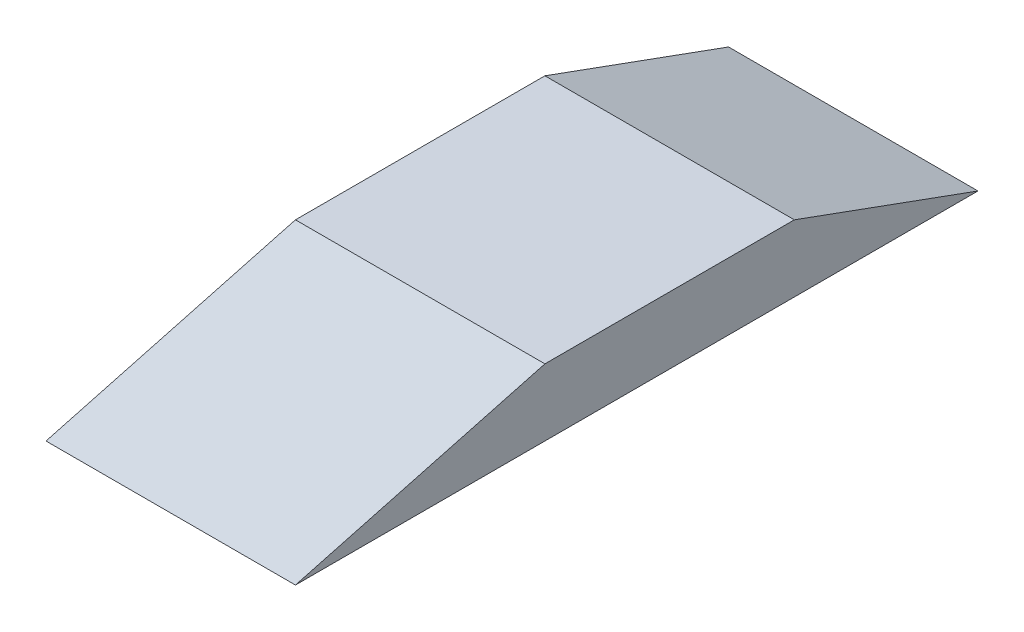
ISO-10303-21;
HEADER;
FILE_DESCRIPTION(('STEP AP214'),'2;1');
FILE_NAME('part.step','',(''),(''),'','','');
FILE_SCHEMA(('AUTOMOTIVE_DESIGN { 1 0 10303 214 1 1 1 1 }'));
ENDSEC;
DATA;
#1=APPLICATION_CONTEXT('core data for automotive mechanical design processes');
#2=APPLICATION_PROTOCOL_DEFINITION('international standard','automotive_design',2000,#1);
#3=PRODUCT_CONTEXT('',#1,'mechanical');
#4=PRODUCT('Part','Part','',(#3));
#5=PRODUCT_RELATED_PRODUCT_CATEGORY('part','',(#4));
#6=PRODUCT_DEFINITION_FORMATION('','',#4);
#7=PRODUCT_DEFINITION_CONTEXT('part definition',#1,'design');
#8=PRODUCT_DEFINITION('design','',#6,#7);
#9=PRODUCT_DEFINITION_SHAPE('','',#8);
#10=(LENGTH_UNIT() NAMED_UNIT(*) SI_UNIT(.MILLI.,.METRE.));
#11=(NAMED_UNIT(*) PLANE_ANGLE_UNIT() SI_UNIT($,.RADIAN.));
#12=(NAMED_UNIT(*) SI_UNIT($,.STERADIAN.) SOLID_ANGLE_UNIT());
#13=UNCERTAINTY_MEASURE_WITH_UNIT(LENGTH_MEASURE(1.E-05),#10,'distance_accuracy_value','');
#14=(GEOMETRIC_REPRESENTATION_CONTEXT(3) GLOBAL_UNCERTAINTY_ASSIGNED_CONTEXT((#13)) GLOBAL_UNIT_ASSIGNED_CONTEXT((#10,
#11,#12)) REPRESENTATION_CONTEXT('',''));
#15=CARTESIAN_POINT('',(0.,0.,0.));
#16=DIRECTION('',(0.,0.,1.));
#17=DIRECTION('',(1.,0.,0.));
#18=AXIS2_PLACEMENT_3D('',#15,#16,#17);
#19=CARTESIAN_POINT('',(1500.,-4.34084634463935E-13,0.));
#20=DIRECTION('',(0.,-1.,0.));
#21=DIRECTION('',(0.,0.,-1.));
#22=AXIS2_PLACEMENT_3D('',#19,#20,#21);
#23=PLANE('',#22);
#24=DIRECTION('',(0.,0.,1.));
#25=VECTOR('',#24,1.);
#26=CARTESIAN_POINT('',(0.,-4.34084634463935E-13,0.));
#27=LINE('',#26,#25);
#28=CARTESIAN_POINT('',(0.,4.44089209850063E-13,-4104.27653364841));
#29=VERTEX_POINT('',#28);
#30=CARTESIAN_POINT('',(0.,0.,0.));
#31=VERTEX_POINT('',#30);
#32=EDGE_CURVE('E109',#29,#31,#27,.T.);
#33=ORIENTED_EDGE('',*,*,#32,.F.);
#34=DIRECTION('',(-1.,0.,0.));
#35=VECTOR('',#34,1.);
#36=CARTESIAN_POINT('',(1500.,4.44089209850063E-13,-4104.27653364841));
#37=LINE('',#36,#35);
#38=CARTESIAN_POINT('',(1500.,4.44089209850063E-13,-4104.27653364841));
#39=VERTEX_POINT('',#38);
#40=EDGE_CURVE('E11',#39,#29,#37,.T.);
#41=ORIENTED_EDGE('',*,*,#40,.F.);
#42=DIRECTION('',(0.,0.,1.));
#43=VECTOR('',#42,1.);
#44=CARTESIAN_POINT('',(1500.,-4.34084634463935E-13,0.));
#45=LINE('',#44,#43);
#46=CARTESIAN_POINT('',(1500.,0.,0.));
#47=VERTEX_POINT('',#46);
#48=EDGE_CURVE('E99',#39,#47,#45,.T.);
#49=ORIENTED_EDGE('',*,*,#48,.T.);
#50=DIRECTION('',(-1.,0.,0.));
#51=VECTOR('',#50,1.);
#52=CARTESIAN_POINT('',(1500.,0.,0.));
#53=LINE('',#52,#51);
#54=EDGE_CURVE('E80',#47,#31,#53,.T.);
#55=ORIENTED_EDGE('',*,*,#54,.T.);
#56=EDGE_LOOP('',(#33,#41,#49,#55));
#57=FACE_BOUND('',#56,.T.);
#58=ADVANCED_FACE('F41',(#57),#23,.T.);
#59=CARTESIAN_POINT('',(1500.,1319.08905127819,-480.109151011695));
#60=DIRECTION('',(0.,0.939692620785911,-0.342020143325662));
#61=DIRECTION('',(0.,0.342020143325662,0.939692620785911));
#62=AXIS2_PLACEMENT_3D('',#59,#60,#61);
#63=PLANE('',#62);
#64=DIRECTION('',(0.,-0.342020143325662,-0.939692620785911));
#65=VECTOR('',#64,1.);
#66=CARTESIAN_POINT('',(0.,1319.08905127819,-480.109151011695));
#67=LINE('',#66,#65);
#68=CARTESIAN_POINT('',(0.,401.923788646674,-3000.));
#69=VERTEX_POINT('',#68);
#70=EDGE_CURVE('E91',#69,#29,#67,.T.);
#71=ORIENTED_EDGE('',*,*,#70,.F.);
#72=DIRECTION('',(-1.,0.,0.));
#73=VECTOR('',#72,1.);
#74=CARTESIAN_POINT('',(1500.,401.923788646674,-3000.));
#75=LINE('',#74,#73);
#76=CARTESIAN_POINT('',(1500.,401.923788646674,-3000.));
#77=VERTEX_POINT('',#76);
#78=EDGE_CURVE('E50',#77,#69,#75,.T.);
#79=ORIENTED_EDGE('',*,*,#78,.F.);
#80=DIRECTION('',(0.,-0.342020143325662,-0.939692620785911));
#81=VECTOR('',#80,1.);
#82=CARTESIAN_POINT('',(1500.,1319.08905127819,-480.109151011695));
#83=LINE('',#82,#81);
#84=EDGE_CURVE('E89',#77,#39,#83,.T.);
#85=ORIENTED_EDGE('',*,*,#84,.T.);
#86=ORIENTED_EDGE('',*,*,#40,.T.);
#87=EDGE_LOOP('',(#71,#79,#85,#86));
#88=FACE_BOUND('',#87,.T.);
#89=ADVANCED_FACE('F88',(#88),#63,.T.);
#90=CARTESIAN_POINT('',(1500.,401.923788646674,0.));
#91=DIRECTION('',(0.,1.,0.));
#92=DIRECTION('',(0.,0.,1.));
#93=AXIS2_PLACEMENT_3D('',#90,#91,#92);
#94=PLANE('',#93);
#95=DIRECTION('',(0.,0.,-1.));
#96=VECTOR('',#95,1.);
#97=CARTESIAN_POINT('',(0.,401.923788646674,0.));
#98=LINE('',#97,#96);
#99=CARTESIAN_POINT('',(0.,401.923788646674,-1500.));
#100=VERTEX_POINT('',#99);
#101=EDGE_CURVE('E115',#100,#69,#98,.T.);
#102=ORIENTED_EDGE('',*,*,#101,.F.);
#103=DIRECTION('',(-1.,0.,0.));
#104=VECTOR('',#103,1.);
#105=CARTESIAN_POINT('',(1500.,401.923788646674,-1500.));
#106=LINE('',#105,#104);
#107=CARTESIAN_POINT('',(1500.,401.923788646674,-1500.));
#108=VERTEX_POINT('',#107);
#109=EDGE_CURVE('E73',#108,#100,#106,.T.);
#110=ORIENTED_EDGE('',*,*,#109,.F.);
#111=DIRECTION('',(0.,0.,-1.));
#112=VECTOR('',#111,1.);
#113=CARTESIAN_POINT('',(1500.,401.923788646674,0.));
#114=LINE('',#113,#112);
#115=EDGE_CURVE('E98',#108,#77,#114,.T.);
#116=ORIENTED_EDGE('',*,*,#115,.T.);
#117=ORIENTED_EDGE('',*,*,#78,.T.);
#118=EDGE_LOOP('',(#102,#110,#116,#117));
#119=FACE_BOUND('',#118,.T.);
#120=ADVANCED_FACE('F102',(#119),#94,.T.);
#121=CARTESIAN_POINT('',(1500.,0.,0.));
#122=DIRECTION('',(0.,-0.96592582628907,-0.258819045102515));
#123=DIRECTION('',(0.,0.258819045102515,-0.96592582628907));
#124=AXIS2_PLACEMENT_3D('',#121,#122,#123);
#125=PLANE('',#124);
#126=DIRECTION('',(0.,-0.258819045102515,0.96592582628907));
#127=VECTOR('',#126,1.);
#128=CARTESIAN_POINT('',(0.,0.,0.));
#129=LINE('',#128,#127);
#130=EDGE_CURVE('E118',#100,#31,#129,.T.);
#131=ORIENTED_EDGE('',*,*,#130,.T.);
#132=ORIENTED_EDGE('',*,*,#54,.F.);
#133=DIRECTION('',(0.,-0.258819045102515,0.96592582628907));
#134=VECTOR('',#133,1.);
#135=CARTESIAN_POINT('',(1500.,0.,0.));
#136=LINE('',#135,#134);
#137=EDGE_CURVE('E58',#108,#47,#136,.T.);
#138=ORIENTED_EDGE('',*,*,#137,.F.);
#139=ORIENTED_EDGE('',*,*,#109,.T.);
#140=EDGE_LOOP('',(#131,#132,#138,#139));
#141=FACE_BOUND('',#140,.T.);
#142=ADVANCED_FACE('F132',(#141),#125,.F.);
#143=CARTESIAN_POINT('',(1500.,0.,0.));
#144=DIRECTION('',(1.,0.,0.));
#145=DIRECTION('',(0.,0.,-1.));
#146=AXIS2_PLACEMENT_3D('',#143,#144,#145);
#147=PLANE('',#146);
#148=ORIENTED_EDGE('',*,*,#48,.F.);
#149=ORIENTED_EDGE('',*,*,#84,.F.);
#150=ORIENTED_EDGE('',*,*,#115,.F.);
#151=ORIENTED_EDGE('',*,*,#137,.T.);
#152=EDGE_LOOP('',(#148,#149,#150,#151));
#153=FACE_BOUND('',#152,.T.);
#154=ADVANCED_FACE('F97',(#153),#147,.T.);
#155=CARTESIAN_POINT('',(0.,0.,0.));
#156=DIRECTION('',(1.,0.,0.));
#157=DIRECTION('',(0.,0.,-1.));
#158=AXIS2_PLACEMENT_3D('',#155,#156,#157);
#159=PLANE('',#158);
#160=ORIENTED_EDGE('',*,*,#32,.T.);
#161=ORIENTED_EDGE('',*,*,#130,.F.);
#162=ORIENTED_EDGE('',*,*,#101,.T.);
#163=ORIENTED_EDGE('',*,*,#70,.T.);
#164=EDGE_LOOP('',(#160,#161,#162,#163));
#165=FACE_BOUND('',#164,.T.);
#166=ADVANCED_FACE('F137',(#165),#159,.F.);
#167=CLOSED_SHELL('',(#58,#89,#120,#142,#154,#166));
#168=MANIFOLD_SOLID_BREP('B2',#167);
#169=ADVANCED_BREP_SHAPE_REPRESENTATION('',(#18,#168),#14);
#170=SHAPE_DEFINITION_REPRESENTATION(#9,#169);
ENDSEC;
END-ISO-10303-21;
